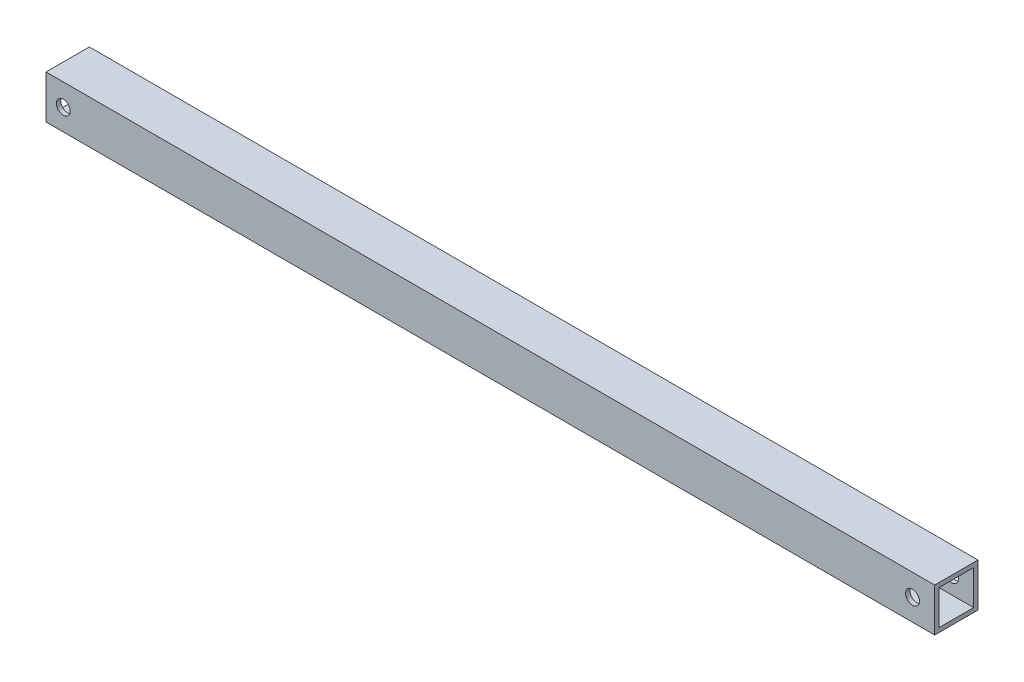
ISO-10303-21;
HEADER;
FILE_DESCRIPTION(('STEP AP214'),'2;1');
FILE_NAME('part.step','',(''),(''),'','','');
FILE_SCHEMA(('AUTOMOTIVE_DESIGN { 1 0 10303 214 1 1 1 1 }'));
ENDSEC;
DATA;
#1=APPLICATION_CONTEXT('core data for automotive mechanical design processes');
#2=APPLICATION_PROTOCOL_DEFINITION('international standard','automotive_design',2000,#1);
#3=PRODUCT_CONTEXT('',#1,'mechanical');
#4=PRODUCT('Part','Part','',(#3));
#5=PRODUCT_RELATED_PRODUCT_CATEGORY('part','',(#4));
#6=PRODUCT_DEFINITION_FORMATION('','',#4);
#7=PRODUCT_DEFINITION_CONTEXT('part definition',#1,'design');
#8=PRODUCT_DEFINITION('design','',#6,#7);
#9=PRODUCT_DEFINITION_SHAPE('','',#8);
#10=(LENGTH_UNIT() NAMED_UNIT(*) SI_UNIT(.MILLI.,.METRE.));
#11=(NAMED_UNIT(*) PLANE_ANGLE_UNIT() SI_UNIT($,.RADIAN.));
#12=(NAMED_UNIT(*) SI_UNIT($,.STERADIAN.) SOLID_ANGLE_UNIT());
#13=UNCERTAINTY_MEASURE_WITH_UNIT(LENGTH_MEASURE(1.E-05),#10,'distance_accuracy_value','');
#14=(GEOMETRIC_REPRESENTATION_CONTEXT(3) GLOBAL_UNCERTAINTY_ASSIGNED_CONTEXT((#13)) GLOBAL_UNIT_ASSIGNED_CONTEXT((#10,
#11,#12)) REPRESENTATION_CONTEXT('',''));
#15=CARTESIAN_POINT('',(0.,0.,0.));
#16=DIRECTION('',(0.,0.,1.));
#17=DIRECTION('',(1.,0.,0.));
#18=AXIS2_PLACEMENT_3D('',#15,#16,#17);
#19=CARTESIAN_POINT('',(-366.384636000507,460.512640001109,10.));
#20=DIRECTION('',(0.,0.,-1.));
#21=DIRECTION('',(-1.,0.,0.));
#22=AXIS2_PLACEMENT_3D('',#19,#20,#21);
#23=CYLINDRICAL_SURFACE('',#22,1.59999999999996);
#24=CARTESIAN_POINT('',(-366.384636000507,460.512640001109,0.999999999999999));
#25=DIRECTION('',(0.,0.,-1.));
#26=DIRECTION('',(-1.,0.,0.));
#27=AXIS2_PLACEMENT_3D('',#24,#25,#26);
#28=CIRCLE('',#27,1.59999999999996);
#29=CARTESIAN_POINT('',(-367.984636000507,460.512640001109,0.999999999999999));
#30=VERTEX_POINT('',#29);
#31=EDGE_CURVE('E139',#30,#30,#28,.T.);
#32=ORIENTED_EDGE('',*,*,#31,.F.);
#33=EDGE_LOOP('',(#32));
#34=FACE_BOUND('',#33,.T.);
#35=CARTESIAN_POINT('',(-366.384636000507,460.512640001109,0.));
#36=DIRECTION('',(0.,0.,1.));
#37=DIRECTION('',(1.,0.,0.));
#38=AXIS2_PLACEMENT_3D('',#35,#36,#37);
#39=CIRCLE('',#38,1.59999999999996);
#40=CARTESIAN_POINT('',(-364.784636000507,460.512640001109,0.));
#41=VERTEX_POINT('',#40);
#42=EDGE_CURVE('E142',#41,#41,#39,.T.);
#43=ORIENTED_EDGE('',*,*,#42,.F.);
#44=EDGE_LOOP('',(#43));
#45=FACE_BOUND('',#44,.T.);
#46=ADVANCED_FACE('F33',(#34,#45),#23,.F.);
#47=CARTESIAN_POINT('',(-562.42503380715,460.456502300154,9.99999999999997));
#48=DIRECTION('',(0.,0.,-1.));
#49=DIRECTION('',(-1.,0.,0.));
#50=AXIS2_PLACEMENT_3D('',#47,#48,#49);
#51=CYLINDRICAL_SURFACE('',#50,1.60000000000002);
#52=CARTESIAN_POINT('',(-562.42503380715,460.456502300154,0.999999999999999));
#53=DIRECTION('',(0.,0.,-1.));
#54=DIRECTION('',(-1.,0.,0.));
#55=AXIS2_PLACEMENT_3D('',#52,#53,#54);
#56=CIRCLE('',#55,1.60000000000002);
#57=CARTESIAN_POINT('',(-564.02503380715,460.456502300154,0.999999999999999));
#58=VERTEX_POINT('',#57);
#59=EDGE_CURVE('E37',#58,#58,#56,.T.);
#60=ORIENTED_EDGE('',*,*,#59,.F.);
#61=EDGE_LOOP('',(#60));
#62=FACE_BOUND('',#61,.T.);
#63=CARTESIAN_POINT('',(-562.42503380715,460.456502300154,0.));
#64=DIRECTION('',(0.,0.,1.));
#65=DIRECTION('',(1.,0.,0.));
#66=AXIS2_PLACEMENT_3D('',#63,#64,#65);
#67=CIRCLE('',#66,1.60000000000002);
#68=CARTESIAN_POINT('',(-560.82503380715,460.456502300154,0.));
#69=VERTEX_POINT('',#68);
#70=EDGE_CURVE('E147',#69,#69,#67,.T.);
#71=ORIENTED_EDGE('',*,*,#70,.F.);
#72=EDGE_LOOP('',(#71));
#73=FACE_BOUND('',#72,.T.);
#74=ADVANCED_FACE('F192',(#62,#73),#51,.F.);
#75=CARTESIAN_POINT('',(-566.42114034898,0.,10.));
#76=DIRECTION('',(-1.,0.,0.));
#77=DIRECTION('',(0.,0.,1.));
#78=AXIS2_PLACEMENT_3D('',#75,#76,#77);
#79=PLANE('',#78);
#80=DIRECTION('',(0.,-1.,0.));
#81=VECTOR('',#80,1.);
#82=CARTESIAN_POINT('',(-566.42114034898,456.5,1.));
#83=LINE('',#82,#81);
#84=CARTESIAN_POINT('',(-566.42114034898,464.5,1.));
#85=VERTEX_POINT('',#84);
#86=CARTESIAN_POINT('',(-566.42114034898,456.5,0.999999999999999));
#87=VERTEX_POINT('',#86);
#88=EDGE_CURVE('E50',#85,#87,#83,.T.);
#89=ORIENTED_EDGE('',*,*,#88,.F.);
#90=DIRECTION('',(0.,0.,-1.));
#91=VECTOR('',#90,1.);
#92=CARTESIAN_POINT('',(-566.42114034898,464.5,1.));
#93=LINE('',#92,#91);
#94=CARTESIAN_POINT('',(-566.42114034898,464.5,9.));
#95=VERTEX_POINT('',#94);
#96=EDGE_CURVE('E117',#95,#85,#93,.T.);
#97=ORIENTED_EDGE('',*,*,#96,.F.);
#98=DIRECTION('',(0.,1.,0.));
#99=VECTOR('',#98,1.);
#100=CARTESIAN_POINT('',(-566.42114034898,456.5,9.));
#101=LINE('',#100,#99);
#102=CARTESIAN_POINT('',(-566.42114034898,456.5,9.));
#103=VERTEX_POINT('',#102);
#104=EDGE_CURVE('E120',#103,#95,#101,.T.);
#105=ORIENTED_EDGE('',*,*,#104,.F.);
#106=DIRECTION('',(0.,0.,1.));
#107=VECTOR('',#106,1.);
#108=CARTESIAN_POINT('',(-566.42114034898,456.5,1.));
#109=LINE('',#108,#107);
#110=EDGE_CURVE('E126',#87,#103,#109,.T.);
#111=ORIENTED_EDGE('',*,*,#110,.F.);
#112=EDGE_LOOP('',(#89,#97,#105,#111));
#113=FACE_BOUND('',#112,.T.);
#114=DIRECTION('',(0.,1.,0.));
#115=VECTOR('',#114,1.);
#116=CARTESIAN_POINT('',(-566.42114034898,0.,0.));
#117=LINE('',#116,#115);
#118=CARTESIAN_POINT('',(-566.42114034898,455.512640001109,0.));
#119=VERTEX_POINT('',#118);
#120=CARTESIAN_POINT('',(-566.42114034898,465.512640001109,0.));
#121=VERTEX_POINT('',#120);
#122=EDGE_CURVE('E164',#119,#121,#117,.T.);
#123=ORIENTED_EDGE('',*,*,#122,.F.);
#124=DIRECTION('',(0.,0.,-1.));
#125=VECTOR('',#124,1.);
#126=CARTESIAN_POINT('',(-566.42114034898,455.512640001109,10.));
#127=LINE('',#126,#125);
#128=CARTESIAN_POINT('',(-566.42114034898,455.512640001109,10.));
#129=VERTEX_POINT('',#128);
#130=EDGE_CURVE('E11',#129,#119,#127,.T.);
#131=ORIENTED_EDGE('',*,*,#130,.F.);
#132=DIRECTION('',(0.,1.,0.));
#133=VECTOR('',#132,1.);
#134=CARTESIAN_POINT('',(-566.42114034898,0.,10.));
#135=LINE('',#134,#133);
#136=CARTESIAN_POINT('',(-566.42114034898,465.512640001109,10.));
#137=VERTEX_POINT('',#136);
#138=EDGE_CURVE('E146',#129,#137,#135,.T.);
#139=ORIENTED_EDGE('',*,*,#138,.T.);
#140=DIRECTION('',(0.,0.,-1.));
#141=VECTOR('',#140,1.);
#142=CARTESIAN_POINT('',(-566.42114034898,465.512640001109,10.));
#143=LINE('',#142,#141);
#144=EDGE_CURVE('E161',#137,#121,#143,.T.);
#145=ORIENTED_EDGE('',*,*,#144,.T.);
#146=EDGE_LOOP('',(#123,#131,#139,#145));
#147=FACE_BOUND('',#146,.T.);
#148=ADVANCED_FACE('F212',(#113,#147),#79,.T.);
#149=CARTESIAN_POINT('',(0.,455.512640001109,10.));
#150=DIRECTION('',(0.,1.,0.));
#151=DIRECTION('',(0.,0.,1.));
#152=AXIS2_PLACEMENT_3D('',#149,#150,#151);
#153=PLANE('',#152);
#154=DIRECTION('',(1.,0.,0.));
#155=VECTOR('',#154,1.);
#156=CARTESIAN_POINT('',(0.,455.512640001109,0.));
#157=LINE('',#156,#155);
#158=CARTESIAN_POINT('',(-361.278987262856,455.512640001109,0.));
#159=VERTEX_POINT('',#158);
#160=EDGE_CURVE('E167',#119,#159,#157,.T.);
#161=ORIENTED_EDGE('',*,*,#160,.T.);
#162=DIRECTION('',(0.,0.,-1.));
#163=VECTOR('',#162,1.);
#164=CARTESIAN_POINT('',(-361.278987262856,455.512640001109,10.));
#165=LINE('',#164,#163);
#166=CARTESIAN_POINT('',(-361.278987262856,455.512640001109,10.));
#167=VERTEX_POINT('',#166);
#168=EDGE_CURVE('E42',#167,#159,#165,.T.);
#169=ORIENTED_EDGE('',*,*,#168,.F.);
#170=DIRECTION('',(1.,0.,0.));
#171=VECTOR('',#170,1.);
#172=CARTESIAN_POINT('',(0.,455.512640001109,10.));
#173=LINE('',#172,#171);
#174=EDGE_CURVE('E150',#129,#167,#173,.T.);
#175=ORIENTED_EDGE('',*,*,#174,.F.);
#176=ORIENTED_EDGE('',*,*,#130,.T.);
#177=EDGE_LOOP('',(#161,#169,#175,#176));
#178=FACE_BOUND('',#177,.T.);
#179=ADVANCED_FACE('F308',(#178),#153,.F.);
#180=CARTESIAN_POINT('',(-361.278987262856,0.,10.));
#181=DIRECTION('',(-1.,0.,0.));
#182=DIRECTION('',(0.,0.,1.));
#183=AXIS2_PLACEMENT_3D('',#180,#181,#182);
#184=PLANE('',#183);
#185=DIRECTION('',(0.,0.,-1.));
#186=VECTOR('',#185,1.);
#187=CARTESIAN_POINT('',(-361.278987262856,464.5,1.));
#188=LINE('',#187,#186);
#189=CARTESIAN_POINT('',(-361.278987262856,464.5,9.));
#190=VERTEX_POINT('',#189);
#191=CARTESIAN_POINT('',(-361.278987262856,464.5,1.));
#192=VERTEX_POINT('',#191);
#193=EDGE_CURVE('E107',#190,#192,#188,.T.);
#194=ORIENTED_EDGE('',*,*,#193,.T.);
#195=DIRECTION('',(0.,-1.,0.));
#196=VECTOR('',#195,1.);
#197=CARTESIAN_POINT('',(-361.278987262856,456.5,1.));
#198=LINE('',#197,#196);
#199=CARTESIAN_POINT('',(-361.278987262856,456.5,1.));
#200=VERTEX_POINT('',#199);
#201=EDGE_CURVE('E101',#192,#200,#198,.T.);
#202=ORIENTED_EDGE('',*,*,#201,.T.);
#203=DIRECTION('',(0.,0.,1.));
#204=VECTOR('',#203,1.);
#205=CARTESIAN_POINT('',(-361.278987262856,456.5,1.));
#206=LINE('',#205,#204);
#207=CARTESIAN_POINT('',(-361.278987262856,456.5,9.));
#208=VERTEX_POINT('',#207);
#209=EDGE_CURVE('E110',#200,#208,#206,.T.);
#210=ORIENTED_EDGE('',*,*,#209,.T.);
#211=DIRECTION('',(0.,1.,0.));
#212=VECTOR('',#211,1.);
#213=CARTESIAN_POINT('',(-361.278987262856,456.5,9.));
#214=LINE('',#213,#212);
#215=EDGE_CURVE('E58',#208,#190,#214,.T.);
#216=ORIENTED_EDGE('',*,*,#215,.T.);
#217=EDGE_LOOP('',(#194,#202,#210,#216));
#218=FACE_BOUND('',#217,.T.);
#219=DIRECTION('',(0.,1.,0.));
#220=VECTOR('',#219,1.);
#221=CARTESIAN_POINT('',(-361.278987262856,0.,0.));
#222=LINE('',#221,#220);
#223=CARTESIAN_POINT('',(-361.278987262856,465.512640001109,0.));
#224=VERTEX_POINT('',#223);
#225=EDGE_CURVE('E170',#159,#224,#222,.T.);
#226=ORIENTED_EDGE('',*,*,#225,.T.);
#227=DIRECTION('',(0.,0.,-1.));
#228=VECTOR('',#227,1.);
#229=CARTESIAN_POINT('',(-361.278987262856,465.512640001109,10.));
#230=LINE('',#229,#228);
#231=CARTESIAN_POINT('',(-361.278987262856,465.512640001109,10.));
#232=VERTEX_POINT('',#231);
#233=EDGE_CURVE('E179',#232,#224,#230,.T.);
#234=ORIENTED_EDGE('',*,*,#233,.F.);
#235=DIRECTION('',(0.,1.,0.));
#236=VECTOR('',#235,1.);
#237=CARTESIAN_POINT('',(-361.278987262856,0.,10.));
#238=LINE('',#237,#236);
#239=EDGE_CURVE('E153',#167,#232,#238,.T.);
#240=ORIENTED_EDGE('',*,*,#239,.F.);
#241=ORIENTED_EDGE('',*,*,#168,.T.);
#242=EDGE_LOOP('',(#226,#234,#240,#241));
#243=FACE_BOUND('',#242,.T.);
#244=ADVANCED_FACE('F114',(#218,#243),#184,.F.);
#245=CARTESIAN_POINT('',(0.,465.512640001109,10.));
#246=DIRECTION('',(0.,1.,0.));
#247=DIRECTION('',(0.,0.,1.));
#248=AXIS2_PLACEMENT_3D('',#245,#246,#247);
#249=PLANE('',#248);
#250=DIRECTION('',(1.,0.,0.));
#251=VECTOR('',#250,1.);
#252=CARTESIAN_POINT('',(0.,465.512640001109,0.));
#253=LINE('',#252,#251);
#254=EDGE_CURVE('E173',#121,#224,#253,.T.);
#255=ORIENTED_EDGE('',*,*,#254,.F.);
#256=ORIENTED_EDGE('',*,*,#144,.F.);
#257=DIRECTION('',(1.,0.,0.));
#258=VECTOR('',#257,1.);
#259=CARTESIAN_POINT('',(0.,465.512640001109,10.));
#260=LINE('',#259,#258);
#261=EDGE_CURVE('E155',#137,#232,#260,.T.);
#262=ORIENTED_EDGE('',*,*,#261,.T.);
#263=ORIENTED_EDGE('',*,*,#233,.T.);
#264=EDGE_LOOP('',(#255,#256,#262,#263));
#265=FACE_BOUND('',#264,.T.);
#266=ADVANCED_FACE('F217',(#265),#249,.T.);
#267=CARTESIAN_POINT('',(-366.384636000507,460.512640001109,9.));
#268=DIRECTION('',(0.,0.,1.));
#269=DIRECTION('',(1.,0.,0.));
#270=AXIS2_PLACEMENT_3D('',#267,#268,#269);
#271=CIRCLE('',#270,1.59999999999996);
#272=CARTESIAN_POINT('',(-364.784636000507,460.512640001109,9.));
#273=VERTEX_POINT('',#272);
#274=EDGE_CURVE('E136',#273,#273,#271,.T.);
#275=ORIENTED_EDGE('',*,*,#274,.F.);
#276=EDGE_LOOP('',(#275));
#277=FACE_BOUND('',#276,.T.);
#278=CARTESIAN_POINT('',(-366.384636000507,460.512640001109,10.));
#279=DIRECTION('',(0.,0.,1.));
#280=DIRECTION('',(1.,0.,0.));
#281=AXIS2_PLACEMENT_3D('',#278,#279,#280);
#282=CIRCLE('',#281,1.59999999999996);
#283=CARTESIAN_POINT('',(-364.784636000507,460.512640001109,10.));
#284=VERTEX_POINT('',#283);
#285=EDGE_CURVE('E143',#284,#284,#282,.T.);
#286=ORIENTED_EDGE('',*,*,#285,.T.);
#287=EDGE_LOOP('',(#286));
#288=FACE_BOUND('',#287,.T.);
#289=ADVANCED_FACE('F35',(#277,#288),#23,.F.);
#290=CARTESIAN_POINT('',(-562.42503380715,460.456502300154,9.));
#291=DIRECTION('',(0.,0.,1.));
#292=DIRECTION('',(1.,0.,0.));
#293=AXIS2_PLACEMENT_3D('',#290,#291,#292);
#294=CIRCLE('',#293,1.60000000000002);
#295=CARTESIAN_POINT('',(-560.82503380715,460.456502300154,9.));
#296=VERTEX_POINT('',#295);
#297=EDGE_CURVE('E132',#296,#296,#294,.T.);
#298=ORIENTED_EDGE('',*,*,#297,.F.);
#299=EDGE_LOOP('',(#298));
#300=FACE_BOUND('',#299,.T.);
#301=CARTESIAN_POINT('',(-562.42503380715,460.456502300154,9.99999999999997));
#302=DIRECTION('',(0.,0.,1.));
#303=DIRECTION('',(1.,0.,0.));
#304=AXIS2_PLACEMENT_3D('',#301,#302,#303);
#305=CIRCLE('',#304,1.60000000000002);
#306=CARTESIAN_POINT('',(-560.82503380715,460.456502300154,9.99999999999997));
#307=VERTEX_POINT('',#306);
#308=EDGE_CURVE('E158',#307,#307,#305,.T.);
#309=ORIENTED_EDGE('',*,*,#308,.T.);
#310=EDGE_LOOP('',(#309));
#311=FACE_BOUND('',#310,.T.);
#312=ADVANCED_FACE('F187',(#300,#311),#51,.F.);
#313=CARTESIAN_POINT('',(0.,0.,10.));
#314=DIRECTION('',(0.,0.,1.));
#315=DIRECTION('',(1.,0.,0.));
#316=AXIS2_PLACEMENT_3D('',#313,#314,#315);
#317=PLANE('',#316);
#318=ORIENTED_EDGE('',*,*,#285,.F.);
#319=EDGE_LOOP('',(#318));
#320=FACE_BOUND('',#319,.T.);
#321=ORIENTED_EDGE('',*,*,#138,.F.);
#322=ORIENTED_EDGE('',*,*,#174,.T.);
#323=ORIENTED_EDGE('',*,*,#239,.T.);
#324=ORIENTED_EDGE('',*,*,#261,.F.);
#325=EDGE_LOOP('',(#321,#322,#323,#324));
#326=FACE_BOUND('',#325,.T.);
#327=ORIENTED_EDGE('',*,*,#308,.F.);
#328=EDGE_LOOP('',(#327));
#329=FACE_BOUND('',#328,.T.);
#330=ADVANCED_FACE('F190',(#320,#326,#329),#317,.T.);
#331=CARTESIAN_POINT('',(0.,0.,0.));
#332=DIRECTION('',(0.,0.,1.));
#333=DIRECTION('',(1.,0.,0.));
#334=AXIS2_PLACEMENT_3D('',#331,#332,#333);
#335=PLANE('',#334);
#336=ORIENTED_EDGE('',*,*,#42,.T.);
#337=EDGE_LOOP('',(#336));
#338=FACE_BOUND('',#337,.T.);
#339=ORIENTED_EDGE('',*,*,#122,.T.);
#340=ORIENTED_EDGE('',*,*,#254,.T.);
#341=ORIENTED_EDGE('',*,*,#225,.F.);
#342=ORIENTED_EDGE('',*,*,#160,.F.);
#343=EDGE_LOOP('',(#339,#340,#341,#342));
#344=FACE_BOUND('',#343,.T.);
#345=ORIENTED_EDGE('',*,*,#70,.T.);
#346=EDGE_LOOP('',(#345));
#347=FACE_BOUND('',#346,.T.);
#348=ADVANCED_FACE('F196',(#338,#344,#347),#335,.F.);
#349=CARTESIAN_POINT('',(-361.278987262856,456.5,1.));
#350=DIRECTION('',(0.,0.,-1.));
#351=DIRECTION('',(-1.,0.,0.));
#352=AXIS2_PLACEMENT_3D('',#349,#350,#351);
#353=PLANE('',#352);
#354=ORIENTED_EDGE('',*,*,#31,.T.);
#355=EDGE_LOOP('',(#354));
#356=FACE_BOUND('',#355,.T.);
#357=ORIENTED_EDGE('',*,*,#59,.T.);
#358=EDGE_LOOP('',(#357));
#359=FACE_BOUND('',#358,.T.);
#360=ORIENTED_EDGE('',*,*,#88,.T.);
#361=DIRECTION('',(-1.,0.,0.));
#362=VECTOR('',#361,1.);
#363=CARTESIAN_POINT('',(-361.278987262856,456.5,1.));
#364=LINE('',#363,#362);
#365=EDGE_CURVE('E97',#200,#87,#364,.T.);
#366=ORIENTED_EDGE('',*,*,#365,.F.);
#367=ORIENTED_EDGE('',*,*,#201,.F.);
#368=DIRECTION('',(-1.,0.,0.));
#369=VECTOR('',#368,1.);
#370=CARTESIAN_POINT('',(-361.278987262856,464.5,1.));
#371=LINE('',#370,#369);
#372=EDGE_CURVE('E130',#192,#85,#371,.T.);
#373=ORIENTED_EDGE('',*,*,#372,.T.);
#374=EDGE_LOOP('',(#360,#366,#367,#373));
#375=FACE_BOUND('',#374,.T.);
#376=ADVANCED_FACE('F99',(#356,#359,#375),#353,.F.);
#377=CARTESIAN_POINT('',(-361.278987262856,464.5,1.));
#378=DIRECTION('',(0.,1.,0.));
#379=DIRECTION('',(0.,0.,1.));
#380=AXIS2_PLACEMENT_3D('',#377,#378,#379);
#381=PLANE('',#380);
#382=ORIENTED_EDGE('',*,*,#96,.T.);
#383=ORIENTED_EDGE('',*,*,#372,.F.);
#384=ORIENTED_EDGE('',*,*,#193,.F.);
#385=DIRECTION('',(-1.,0.,0.));
#386=VECTOR('',#385,1.);
#387=CARTESIAN_POINT('',(-361.278987262856,464.5,9.));
#388=LINE('',#387,#386);
#389=EDGE_CURVE('E133',#190,#95,#388,.T.);
#390=ORIENTED_EDGE('',*,*,#389,.T.);
#391=EDGE_LOOP('',(#382,#383,#384,#390));
#392=FACE_BOUND('',#391,.T.);
#393=ADVANCED_FACE('F228',(#392),#381,.F.);
#394=CARTESIAN_POINT('',(-361.278987262856,456.5,9.));
#395=DIRECTION('',(0.,0.,1.));
#396=DIRECTION('',(1.,0.,0.));
#397=AXIS2_PLACEMENT_3D('',#394,#395,#396);
#398=PLANE('',#397);
#399=ORIENTED_EDGE('',*,*,#274,.T.);
#400=EDGE_LOOP('',(#399));
#401=FACE_BOUND('',#400,.T.);
#402=ORIENTED_EDGE('',*,*,#297,.T.);
#403=EDGE_LOOP('',(#402));
#404=FACE_BOUND('',#403,.T.);
#405=ORIENTED_EDGE('',*,*,#104,.T.);
#406=ORIENTED_EDGE('',*,*,#389,.F.);
#407=ORIENTED_EDGE('',*,*,#215,.F.);
#408=DIRECTION('',(-1.,0.,0.));
#409=VECTOR('',#408,1.);
#410=CARTESIAN_POINT('',(-361.278987262856,456.5,9.));
#411=LINE('',#410,#409);
#412=EDGE_CURVE('E106',#208,#103,#411,.T.);
#413=ORIENTED_EDGE('',*,*,#412,.T.);
#414=EDGE_LOOP('',(#405,#406,#407,#413));
#415=FACE_BOUND('',#414,.T.);
#416=ADVANCED_FACE('F185',(#401,#404,#415),#398,.F.);
#417=CARTESIAN_POINT('',(-361.278987262856,456.5,1.));
#418=DIRECTION('',(0.,-1.,0.));
#419=DIRECTION('',(0.,0.,-1.));
#420=AXIS2_PLACEMENT_3D('',#417,#418,#419);
#421=PLANE('',#420);
#422=ORIENTED_EDGE('',*,*,#110,.T.);
#423=ORIENTED_EDGE('',*,*,#412,.F.);
#424=ORIENTED_EDGE('',*,*,#209,.F.);
#425=ORIENTED_EDGE('',*,*,#365,.T.);
#426=EDGE_LOOP('',(#422,#423,#424,#425));
#427=FACE_BOUND('',#426,.T.);
#428=ADVANCED_FACE('F111',(#427),#421,.F.);
#429=CLOSED_SHELL('',(#46,#74,#148,#179,#244,#266,#289,#312,#330,#348,#376,#393,#416,#428));
#430=MANIFOLD_SOLID_BREP('B2',#429);
#431=ADVANCED_BREP_SHAPE_REPRESENTATION('',(#18,#430),#14);
#432=SHAPE_DEFINITION_REPRESENTATION(#9,#431);
ENDSEC;
END-ISO-10303-21;
